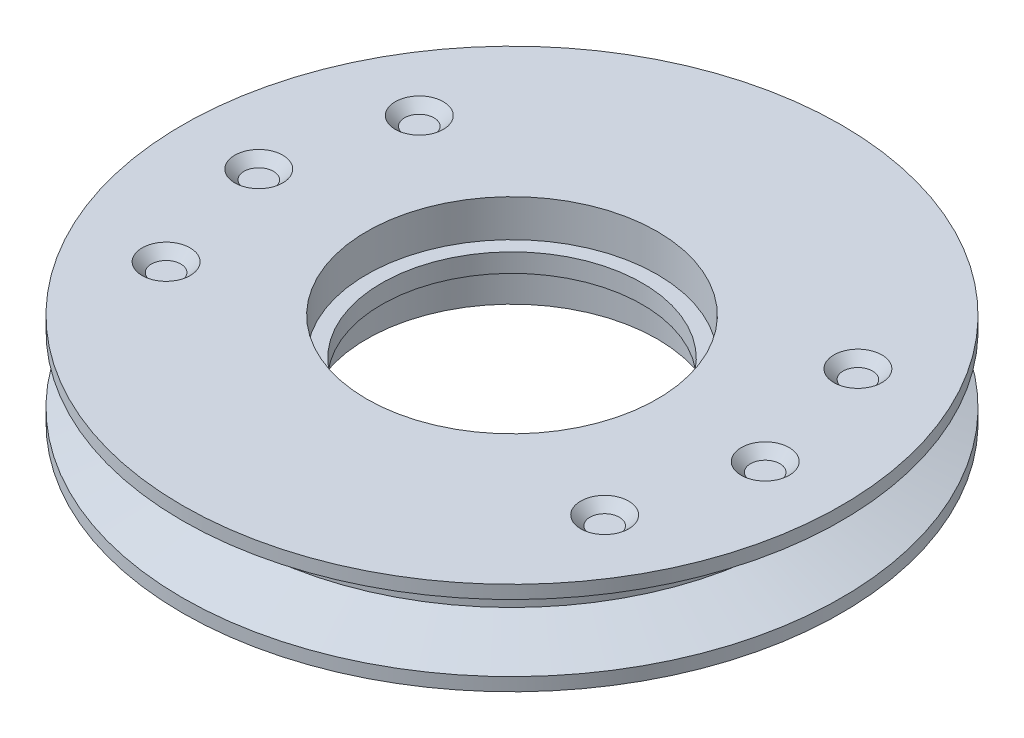
ISO-10303-21;
HEADER;
FILE_DESCRIPTION(('STEP AP214'),'2;1');
FILE_NAME('part.step','',(''),(''),'','','');
FILE_SCHEMA(('AUTOMOTIVE_DESIGN { 1 0 10303 214 1 1 1 1 }'));
ENDSEC;
DATA;
#1=APPLICATION_CONTEXT('core data for automotive mechanical design processes');
#2=APPLICATION_PROTOCOL_DEFINITION('international standard','automotive_design',2000,#1);
#3=PRODUCT_CONTEXT('',#1,'mechanical');
#4=PRODUCT('Part','Part','',(#3));
#5=PRODUCT_RELATED_PRODUCT_CATEGORY('part','',(#4));
#6=PRODUCT_DEFINITION_FORMATION('','',#4);
#7=PRODUCT_DEFINITION_CONTEXT('part definition',#1,'design');
#8=PRODUCT_DEFINITION('design','',#6,#7);
#9=PRODUCT_DEFINITION_SHAPE('','',#8);
#10=(LENGTH_UNIT() NAMED_UNIT(*) SI_UNIT(.MILLI.,.METRE.));
#11=(NAMED_UNIT(*) PLANE_ANGLE_UNIT() SI_UNIT($,.RADIAN.));
#12=(NAMED_UNIT(*) SI_UNIT($,.STERADIAN.) SOLID_ANGLE_UNIT());
#13=UNCERTAINTY_MEASURE_WITH_UNIT(LENGTH_MEASURE(1.E-05),#10,'distance_accuracy_value','');
#14=(GEOMETRIC_REPRESENTATION_CONTEXT(3) GLOBAL_UNCERTAINTY_ASSIGNED_CONTEXT((#13)) GLOBAL_UNIT_ASSIGNED_CONTEXT((#10,
#11,#12)) REPRESENTATION_CONTEXT('',''));
#15=CARTESIAN_POINT('',(0.,0.,0.));
#16=DIRECTION('',(0.,0.,1.));
#17=DIRECTION('',(1.,0.,0.));
#18=AXIS2_PLACEMENT_3D('',#15,#16,#17);
#19=CARTESIAN_POINT('',(0.,0.,0.));
#20=DIRECTION('',(0.,-1.,0.));
#21=DIRECTION('',(0.,0.,-1.));
#22=AXIS2_PLACEMENT_3D('',#19,#20,#21);
#23=CYLINDRICAL_SURFACE('',#22,39.);
#24=CARTESIAN_POINT('',(0.,-12.5,0.));
#25=DIRECTION('',(0.,-1.,0.));
#26=DIRECTION('',(0.,0.,-1.));
#27=AXIS2_PLACEMENT_3D('',#24,#25,#26);
#28=CIRCLE('',#27,39.);
#29=CARTESIAN_POINT('',(0.,-12.5,-39.));
#30=VERTEX_POINT('',#29);
#31=EDGE_CURVE('E77',#30,#30,#28,.T.);
#32=ORIENTED_EDGE('',*,*,#31,.T.);
#33=EDGE_LOOP('',(#32));
#34=FACE_BOUND('',#33,.T.);
#35=CARTESIAN_POINT('',(0.,-2.5,0.));
#36=DIRECTION('',(0.,1.,0.));
#37=DIRECTION('',(0.,0.,1.));
#38=AXIS2_PLACEMENT_3D('',#35,#36,#37);
#39=CIRCLE('',#38,39.);
#40=CARTESIAN_POINT('',(0.,-2.5,39.));
#41=VERTEX_POINT('',#40);
#42=EDGE_CURVE('E99',#41,#41,#39,.T.);
#43=ORIENTED_EDGE('',*,*,#42,.T.);
#44=EDGE_LOOP('',(#43));
#45=FACE_BOUND('',#44,.T.);
#46=ADVANCED_FACE('F37',(#34,#45),#23,.F.);
#47=CARTESIAN_POINT('',(0.,-12.5,-39.));
#48=DIRECTION('',(0.,-1.,0.));
#49=DIRECTION('',(0.,0.,-1.));
#50=AXIS2_PLACEMENT_3D('',#47,#48,#49);
#51=PLANE('',#50);
#52=CARTESIAN_POINT('',(0.,-12.5,0.));
#53=DIRECTION('',(0.,-1.,0.));
#54=DIRECTION('',(0.,0.,-1.));
#55=AXIS2_PLACEMENT_3D('',#52,#53,#54);
#56=CIRCLE('',#55,88.5);
#57=CARTESIAN_POINT('',(0.,-12.5,-88.5));
#58=VERTEX_POINT('',#57);
#59=EDGE_CURVE('E45',#58,#58,#56,.T.);
#60=ORIENTED_EDGE('',*,*,#59,.T.);
#61=EDGE_LOOP('',(#60));
#62=FACE_BOUND('',#61,.T.);
#63=ORIENTED_EDGE('',*,*,#31,.F.);
#64=EDGE_LOOP('',(#63));
#65=FACE_BOUND('',#64,.T.);
#66=ADVANCED_FACE('F39',(#62,#65),#51,.T.);
#67=CARTESIAN_POINT('',(0.,0.,0.));
#68=DIRECTION('',(0.,-1.,0.));
#69=DIRECTION('',(0.,0.,-1.));
#70=AXIS2_PLACEMENT_3D('',#67,#68,#69);
#71=CYLINDRICAL_SURFACE('',#70,88.5);
#72=CARTESIAN_POINT('',(0.,-8.95955351399292,0.));
#73=DIRECTION('',(0.,-1.,0.));
#74=DIRECTION('',(0.,0.,-1.));
#75=AXIS2_PLACEMENT_3D('',#72,#73,#74);
#76=CIRCLE('',#75,88.5);
#77=CARTESIAN_POINT('',(0.,-8.95955351399292,-88.5));
#78=VERTEX_POINT('',#77);
#79=EDGE_CURVE('E50',#78,#78,#76,.T.);
#80=ORIENTED_EDGE('',*,*,#79,.T.);
#81=EDGE_LOOP('',(#80));
#82=FACE_BOUND('',#81,.T.);
#83=ORIENTED_EDGE('',*,*,#59,.F.);
#84=EDGE_LOOP('',(#83));
#85=FACE_BOUND('',#84,.T.);
#86=ADVANCED_FACE('F167',(#82,#85),#71,.T.);
#87=CARTESIAN_POINT('',(0.,-8.95955351399292,0.));
#88=DIRECTION('',(0.,-1.,0.));
#89=DIRECTION('',(0.,0.,-1.));
#90=AXIS2_PLACEMENT_3D('',#87,#88,#89);
#91=CONICAL_SURFACE('',#90,88.5,1.22173047639604);
#92=CARTESIAN_POINT('',(0.,-3.5,0.));
#93=DIRECTION('',(0.,-1.,0.));
#94=DIRECTION('',(0.,0.,-1.));
#95=AXIS2_PLACEMENT_3D('',#92,#93,#94);
#96=CIRCLE('',#95,73.5);
#97=CARTESIAN_POINT('',(0.,-3.5,-73.5));
#98=VERTEX_POINT('',#97);
#99=EDGE_CURVE('E55',#98,#98,#96,.T.);
#100=ORIENTED_EDGE('',*,*,#99,.T.);
#101=EDGE_LOOP('',(#100));
#102=FACE_BOUND('',#101,.T.);
#103=ORIENTED_EDGE('',*,*,#79,.F.);
#104=EDGE_LOOP('',(#103));
#105=FACE_BOUND('',#104,.T.);
#106=ADVANCED_FACE('F203',(#102,#105),#91,.T.);
#107=CARTESIAN_POINT('',(0.,0.,0.));
#108=DIRECTION('',(0.,-1.,0.));
#109=DIRECTION('',(0.,0.,-1.));
#110=AXIS2_PLACEMENT_3D('',#107,#108,#109);
#111=CYLINDRICAL_SURFACE('',#110,73.5);
#112=CARTESIAN_POINT('',(0.,3.5,0.));
#113=DIRECTION('',(0.,-1.,0.));
#114=DIRECTION('',(0.,0.,-1.));
#115=AXIS2_PLACEMENT_3D('',#112,#113,#114);
#116=CIRCLE('',#115,73.5);
#117=CARTESIAN_POINT('',(0.,3.5,-73.5));
#118=VERTEX_POINT('',#117);
#119=EDGE_CURVE('E61',#118,#118,#116,.T.);
#120=ORIENTED_EDGE('',*,*,#119,.T.);
#121=EDGE_LOOP('',(#120));
#122=FACE_BOUND('',#121,.T.);
#123=ORIENTED_EDGE('',*,*,#99,.F.);
#124=EDGE_LOOP('',(#123));
#125=FACE_BOUND('',#124,.T.);
#126=ADVANCED_FACE('F197',(#122,#125),#111,.T.);
#127=CARTESIAN_POINT('',(0.,3.5,0.));
#128=DIRECTION('',(0.,1.,0.));
#129=DIRECTION('',(0.,0.,1.));
#130=AXIS2_PLACEMENT_3D('',#127,#128,#129);
#131=CONICAL_SURFACE('',#130,73.5,1.22173047639603);
#132=CARTESIAN_POINT('',(0.,8.95955351399305,0.));
#133=DIRECTION('',(0.,-1.,0.));
#134=DIRECTION('',(0.,0.,-1.));
#135=AXIS2_PLACEMENT_3D('',#132,#133,#134);
#136=CIRCLE('',#135,88.5);
#137=CARTESIAN_POINT('',(0.,8.95955351399305,-88.5));
#138=VERTEX_POINT('',#137);
#139=EDGE_CURVE('E65',#138,#138,#136,.T.);
#140=ORIENTED_EDGE('',*,*,#139,.T.);
#141=EDGE_LOOP('',(#140));
#142=FACE_BOUND('',#141,.T.);
#143=ORIENTED_EDGE('',*,*,#119,.F.);
#144=EDGE_LOOP('',(#143));
#145=FACE_BOUND('',#144,.T.);
#146=ADVANCED_FACE('F191',(#142,#145),#131,.T.);
#147=CARTESIAN_POINT('',(0.,0.,0.));
#148=DIRECTION('',(0.,-1.,0.));
#149=DIRECTION('',(0.,0.,-1.));
#150=AXIS2_PLACEMENT_3D('',#147,#148,#149);
#151=CYLINDRICAL_SURFACE('',#150,88.5);
#152=CARTESIAN_POINT('',(0.,12.5,0.));
#153=DIRECTION('',(0.,-1.,0.));
#154=DIRECTION('',(0.,0.,-1.));
#155=AXIS2_PLACEMENT_3D('',#152,#153,#154);
#156=CIRCLE('',#155,88.5);
#157=CARTESIAN_POINT('',(0.,12.5,-88.5));
#158=VERTEX_POINT('',#157);
#159=EDGE_CURVE('E69',#158,#158,#156,.T.);
#160=ORIENTED_EDGE('',*,*,#159,.T.);
#161=EDGE_LOOP('',(#160));
#162=FACE_BOUND('',#161,.T.);
#163=ORIENTED_EDGE('',*,*,#139,.F.);
#164=EDGE_LOOP('',(#163));
#165=FACE_BOUND('',#164,.T.);
#166=ADVANCED_FACE('F181',(#162,#165),#151,.T.);
#167=CARTESIAN_POINT('',(0.,12.5,-39.));
#168=DIRECTION('',(0.,1.,0.));
#169=DIRECTION('',(0.,0.,1.));
#170=AXIS2_PLACEMENT_3D('',#167,#168,#169);
#171=PLANE('',#170);
#172=CARTESIAN_POINT('',(-58.8897274573418,12.5,-34.0000000000001));
#173=DIRECTION('',(0.,1.,0.));
#174=DIRECTION('',(0.,0.,-1.));
#175=AXIS2_PLACEMENT_3D('',#172,#173,#174);
#176=CIRCLE('',#175,6.45);
#177=CARTESIAN_POINT('',(-58.8897274573418,12.5,-40.4500000000001));
#178=VERTEX_POINT('',#177);
#179=EDGE_CURVE('E95',#178,#178,#176,.T.);
#180=ORIENTED_EDGE('',*,*,#179,.F.);
#181=EDGE_LOOP('',(#180));
#182=FACE_BOUND('',#181,.T.);
#183=CARTESIAN_POINT('',(68.,12.5,0.));
#184=DIRECTION('',(0.,1.,0.));
#185=DIRECTION('',(0.,0.,1.));
#186=AXIS2_PLACEMENT_3D('',#183,#184,#185);
#187=CIRCLE('',#186,6.45);
#188=CARTESIAN_POINT('',(68.,12.5,6.45));
#189=VERTEX_POINT('',#188);
#190=EDGE_CURVE('E94',#189,#189,#187,.T.);
#191=ORIENTED_EDGE('',*,*,#190,.F.);
#192=EDGE_LOOP('',(#191));
#193=FACE_BOUND('',#192,.T.);
#194=CARTESIAN_POINT('',(-68.,12.5,0.));
#195=DIRECTION('',(0.,1.,0.));
#196=DIRECTION('',(0.,0.,-1.));
#197=AXIS2_PLACEMENT_3D('',#194,#195,#196);
#198=CIRCLE('',#197,6.45);
#199=CARTESIAN_POINT('',(-68.,12.5,-6.45));
#200=VERTEX_POINT('',#199);
#201=EDGE_CURVE('E104',#200,#200,#198,.T.);
#202=ORIENTED_EDGE('',*,*,#201,.F.);
#203=EDGE_LOOP('',(#202));
#204=FACE_BOUND('',#203,.T.);
#205=CARTESIAN_POINT('',(-58.8897274573418,12.5,34.0000000000001));
#206=DIRECTION('',(0.,1.,0.));
#207=DIRECTION('',(0.,0.,1.));
#208=AXIS2_PLACEMENT_3D('',#205,#206,#207);
#209=CIRCLE('',#208,6.45);
#210=CARTESIAN_POINT('',(-58.8897274573418,12.5,40.4500000000001));
#211=VERTEX_POINT('',#210);
#212=EDGE_CURVE('E112',#211,#211,#209,.T.);
#213=ORIENTED_EDGE('',*,*,#212,.F.);
#214=EDGE_LOOP('',(#213));
#215=FACE_BOUND('',#214,.T.);
#216=CARTESIAN_POINT('',(58.8897274573418,12.5,34.0000000000001));
#217=DIRECTION('',(0.,1.,0.));
#218=DIRECTION('',(0.,0.,-1.));
#219=AXIS2_PLACEMENT_3D('',#216,#217,#218);
#220=CIRCLE('',#219,6.45);
#221=CARTESIAN_POINT('',(58.8897274573418,12.5,27.5500000000001));
#222=VERTEX_POINT('',#221);
#223=EDGE_CURVE('E120',#222,#222,#220,.T.);
#224=ORIENTED_EDGE('',*,*,#223,.F.);
#225=EDGE_LOOP('',(#224));
#226=FACE_BOUND('',#225,.T.);
#227=CARTESIAN_POINT('',(58.8897274573418,12.5,-34.0000000000001));
#228=DIRECTION('',(0.,1.,0.));
#229=DIRECTION('',(0.,0.,1.));
#230=AXIS2_PLACEMENT_3D('',#227,#228,#229);
#231=CIRCLE('',#230,6.45);
#232=CARTESIAN_POINT('',(58.8897274573418,12.5,-27.5500000000001));
#233=VERTEX_POINT('',#232);
#234=EDGE_CURVE('E85',#233,#233,#231,.T.);
#235=ORIENTED_EDGE('',*,*,#234,.F.);
#236=EDGE_LOOP('',(#235));
#237=FACE_BOUND('',#236,.T.);
#238=CARTESIAN_POINT('',(0.,12.5,0.));
#239=DIRECTION('',(0.,-1.,0.));
#240=DIRECTION('',(0.,0.,-1.));
#241=AXIS2_PLACEMENT_3D('',#238,#239,#240);
#242=CIRCLE('',#241,39.);
#243=CARTESIAN_POINT('',(0.,12.5,-39.));
#244=VERTEX_POINT('',#243);
#245=EDGE_CURVE('E73',#244,#244,#242,.T.);
#246=ORIENTED_EDGE('',*,*,#245,.T.);
#247=EDGE_LOOP('',(#246));
#248=FACE_BOUND('',#247,.T.);
#249=ORIENTED_EDGE('',*,*,#159,.F.);
#250=EDGE_LOOP('',(#249));
#251=FACE_BOUND('',#250,.T.);
#252=ADVANCED_FACE('F173',(#182,#193,#204,#215,#226,#237,#248,#251),#171,.T.);
#253=CARTESIAN_POINT('',(0.,2.5,0.));
#254=DIRECTION('',(0.,1.,0.));
#255=DIRECTION('',(0.,0.,1.));
#256=AXIS2_PLACEMENT_3D('',#253,#254,#255);
#257=CIRCLE('',#256,39.);
#258=CARTESIAN_POINT('',(0.,2.5,39.));
#259=VERTEX_POINT('',#258);
#260=EDGE_CURVE('E10',#259,#259,#257,.T.);
#261=ORIENTED_EDGE('',*,*,#260,.F.);
#262=EDGE_LOOP('',(#261));
#263=FACE_BOUND('',#262,.T.);
#264=ORIENTED_EDGE('',*,*,#245,.F.);
#265=EDGE_LOOP('',(#264));
#266=FACE_BOUND('',#265,.T.);
#267=ADVANCED_FACE('F163',(#263,#266),#23,.F.);
#268=CARTESIAN_POINT('',(58.8897274573418,12.5,-34.0000000000001));
#269=DIRECTION('',(0.,1.,0.));
#270=DIRECTION('',(0.,0.,1.));
#271=AXIS2_PLACEMENT_3D('',#268,#269,#270);
#272=CONICAL_SURFACE('',#271,6.45,0.78539816339745);
#273=CARTESIAN_POINT('',(58.8897274573418,10.,-34.0000000000001));
#274=DIRECTION('',(0.,1.,0.));
#275=DIRECTION('',(0.,0.,1.));
#276=AXIS2_PLACEMENT_3D('',#273,#274,#275);
#277=CIRCLE('',#276,3.94999999999999);
#278=CARTESIAN_POINT('',(58.8897274573418,10.,-30.0500000000001));
#279=VERTEX_POINT('',#278);
#280=EDGE_CURVE('E81',#279,#279,#277,.T.);
#281=ORIENTED_EDGE('',*,*,#280,.F.);
#282=EDGE_LOOP('',(#281));
#283=FACE_BOUND('',#282,.T.);
#284=ORIENTED_EDGE('',*,*,#234,.T.);
#285=EDGE_LOOP('',(#284));
#286=FACE_BOUND('',#285,.T.);
#287=ADVANCED_FACE('F172',(#283,#286),#272,.F.);
#288=CARTESIAN_POINT('',(58.8897274573418,10.,-34.0000000000001));
#289=DIRECTION('',(0.,1.,0.));
#290=DIRECTION('',(0.,0.,1.));
#291=AXIS2_PLACEMENT_3D('',#288,#289,#290);
#292=PLANE('',#291);
#293=ORIENTED_EDGE('',*,*,#280,.T.);
#294=EDGE_LOOP('',(#293));
#295=FACE_BOUND('',#294,.T.);
#296=ADVANCED_FACE('F179',(#295),#292,.T.);
#297=CARTESIAN_POINT('',(58.8897274573418,12.5,34.0000000000001));
#298=DIRECTION('',(0.,1.,0.));
#299=DIRECTION('',(0.,0.,-1.));
#300=AXIS2_PLACEMENT_3D('',#297,#298,#299);
#301=CONICAL_SURFACE('',#300,6.45,0.78539816339745);
#302=CARTESIAN_POINT('',(58.8897274573418,10.,34.0000000000001));
#303=DIRECTION('',(0.,-1.,0.));
#304=DIRECTION('',(0.,0.,-1.));
#305=AXIS2_PLACEMENT_3D('',#302,#303,#304);
#306=CIRCLE('',#305,3.94999999999999);
#307=CARTESIAN_POINT('',(58.8897274573418,10.,30.0500000000001));
#308=VERTEX_POINT('',#307);
#309=EDGE_CURVE('E89',#308,#308,#306,.F.);
#310=ORIENTED_EDGE('',*,*,#309,.F.);
#311=EDGE_LOOP('',(#310));
#312=FACE_BOUND('',#311,.T.);
#313=ORIENTED_EDGE('',*,*,#223,.T.);
#314=EDGE_LOOP('',(#313));
#315=FACE_BOUND('',#314,.T.);
#316=ADVANCED_FACE('F254',(#312,#315),#301,.F.);
#317=CARTESIAN_POINT('',(58.8897274573418,10.,34.0000000000001));
#318=DIRECTION('',(0.,-1.,0.));
#319=DIRECTION('',(0.,0.,-1.));
#320=AXIS2_PLACEMENT_3D('',#317,#318,#319);
#321=PLANE('',#320);
#322=ORIENTED_EDGE('',*,*,#309,.T.);
#323=EDGE_LOOP('',(#322));
#324=FACE_BOUND('',#323,.T.);
#325=ADVANCED_FACE('F264',(#324),#321,.F.);
#326=CARTESIAN_POINT('',(-58.8897274573418,12.5,34.0000000000001));
#327=DIRECTION('',(0.,1.,0.));
#328=DIRECTION('',(0.,0.,1.));
#329=AXIS2_PLACEMENT_3D('',#326,#327,#328);
#330=CONICAL_SURFACE('',#329,6.45,0.78539816339745);
#331=CARTESIAN_POINT('',(-58.8897274573418,10.,34.0000000000001));
#332=DIRECTION('',(0.,1.,0.));
#333=DIRECTION('',(0.,0.,1.));
#334=AXIS2_PLACEMENT_3D('',#331,#332,#333);
#335=CIRCLE('',#334,3.94999999999999);
#336=CARTESIAN_POINT('',(-58.8897274573418,10.,37.9500000000001));
#337=VERTEX_POINT('',#336);
#338=EDGE_CURVE('E116',#337,#337,#335,.T.);
#339=ORIENTED_EDGE('',*,*,#338,.F.);
#340=EDGE_LOOP('',(#339));
#341=FACE_BOUND('',#340,.T.);
#342=ORIENTED_EDGE('',*,*,#212,.T.);
#343=EDGE_LOOP('',(#342));
#344=FACE_BOUND('',#343,.T.);
#345=ADVANCED_FACE('F274',(#341,#344),#330,.F.);
#346=CARTESIAN_POINT('',(-58.8897274573418,10.,34.0000000000001));
#347=DIRECTION('',(0.,1.,0.));
#348=DIRECTION('',(0.,0.,1.));
#349=AXIS2_PLACEMENT_3D('',#346,#347,#348);
#350=PLANE('',#349);
#351=ORIENTED_EDGE('',*,*,#338,.T.);
#352=EDGE_LOOP('',(#351));
#353=FACE_BOUND('',#352,.T.);
#354=ADVANCED_FACE('F284',(#353),#350,.T.);
#355=CARTESIAN_POINT('',(-68.,12.5,0.));
#356=DIRECTION('',(0.,1.,0.));
#357=DIRECTION('',(0.,0.,-1.));
#358=AXIS2_PLACEMENT_3D('',#355,#356,#357);
#359=CONICAL_SURFACE('',#358,6.45,0.78539816339745);
#360=CARTESIAN_POINT('',(-68.,10.,0.));
#361=DIRECTION('',(0.,-1.,0.));
#362=DIRECTION('',(0.,0.,-1.));
#363=AXIS2_PLACEMENT_3D('',#360,#361,#362);
#364=CIRCLE('',#363,3.94999999999999);
#365=CARTESIAN_POINT('',(-68.,10.,-3.94999999999999));
#366=VERTEX_POINT('',#365);
#367=EDGE_CURVE('E108',#366,#366,#364,.F.);
#368=ORIENTED_EDGE('',*,*,#367,.F.);
#369=EDGE_LOOP('',(#368));
#370=FACE_BOUND('',#369,.T.);
#371=ORIENTED_EDGE('',*,*,#201,.T.);
#372=EDGE_LOOP('',(#371));
#373=FACE_BOUND('',#372,.T.);
#374=ADVANCED_FACE('F294',(#370,#373),#359,.F.);
#375=CARTESIAN_POINT('',(-68.,10.,0.));
#376=DIRECTION('',(0.,-1.,0.));
#377=DIRECTION('',(0.,0.,-1.));
#378=AXIS2_PLACEMENT_3D('',#375,#376,#377);
#379=PLANE('',#378);
#380=ORIENTED_EDGE('',*,*,#367,.T.);
#381=EDGE_LOOP('',(#380));
#382=FACE_BOUND('',#381,.T.);
#383=ADVANCED_FACE('F304',(#382),#379,.F.);
#384=CARTESIAN_POINT('',(68.,12.5,0.));
#385=DIRECTION('',(0.,1.,0.));
#386=DIRECTION('',(0.,0.,1.));
#387=AXIS2_PLACEMENT_3D('',#384,#385,#386);
#388=CONICAL_SURFACE('',#387,6.45,0.78539816339745);
#389=CARTESIAN_POINT('',(68.,10.,0.));
#390=DIRECTION('',(0.,1.,0.));
#391=DIRECTION('',(0.,0.,1.));
#392=AXIS2_PLACEMENT_3D('',#389,#390,#391);
#393=CIRCLE('',#392,3.94999999999999);
#394=CARTESIAN_POINT('',(68.,10.,3.94999999999999));
#395=VERTEX_POINT('',#394);
#396=EDGE_CURVE('E100',#395,#395,#393,.T.);
#397=ORIENTED_EDGE('',*,*,#396,.F.);
#398=EDGE_LOOP('',(#397));
#399=FACE_BOUND('',#398,.T.);
#400=ORIENTED_EDGE('',*,*,#190,.T.);
#401=EDGE_LOOP('',(#400));
#402=FACE_BOUND('',#401,.T.);
#403=ADVANCED_FACE('F314',(#399,#402),#388,.F.);
#404=CARTESIAN_POINT('',(68.,10.,0.));
#405=DIRECTION('',(0.,1.,0.));
#406=DIRECTION('',(0.,0.,1.));
#407=AXIS2_PLACEMENT_3D('',#404,#405,#406);
#408=PLANE('',#407);
#409=ORIENTED_EDGE('',*,*,#396,.T.);
#410=EDGE_LOOP('',(#409));
#411=FACE_BOUND('',#410,.T.);
#412=ADVANCED_FACE('F324',(#411),#408,.T.);
#413=CARTESIAN_POINT('',(-58.8897274573418,12.5,-34.0000000000001));
#414=DIRECTION('',(0.,1.,0.));
#415=DIRECTION('',(0.,0.,-1.));
#416=AXIS2_PLACEMENT_3D('',#413,#414,#415);
#417=CONICAL_SURFACE('',#416,6.45,0.78539816339745);
#418=CARTESIAN_POINT('',(-58.8897274573418,10.,-34.0000000000001));
#419=DIRECTION('',(0.,-1.,0.));
#420=DIRECTION('',(0.,0.,-1.));
#421=AXIS2_PLACEMENT_3D('',#418,#419,#420);
#422=CIRCLE('',#421,3.94999999999999);
#423=CARTESIAN_POINT('',(-58.8897274573418,10.,-37.9500000000001));
#424=VERTEX_POINT('',#423);
#425=EDGE_CURVE('E90',#424,#424,#422,.F.);
#426=ORIENTED_EDGE('',*,*,#425,.F.);
#427=EDGE_LOOP('',(#426));
#428=FACE_BOUND('',#427,.T.);
#429=ORIENTED_EDGE('',*,*,#179,.T.);
#430=EDGE_LOOP('',(#429));
#431=FACE_BOUND('',#430,.T.);
#432=ADVANCED_FACE('F156',(#428,#431),#417,.F.);
#433=CARTESIAN_POINT('',(-58.8897274573418,10.,-34.0000000000001));
#434=DIRECTION('',(0.,-1.,0.));
#435=DIRECTION('',(0.,0.,-1.));
#436=AXIS2_PLACEMENT_3D('',#433,#434,#435);
#437=PLANE('',#436);
#438=ORIENTED_EDGE('',*,*,#425,.T.);
#439=EDGE_LOOP('',(#438));
#440=FACE_BOUND('',#439,.T.);
#441=ADVANCED_FACE('F148',(#440),#437,.F.);
#442=CARTESIAN_POINT('',(0.,2.5,0.));
#443=DIRECTION('',(0.,1.,0.));
#444=DIRECTION('',(0.,0.,1.));
#445=AXIS2_PLACEMENT_3D('',#442,#443,#444);
#446=PLANE('',#445);
#447=ORIENTED_EDGE('',*,*,#260,.T.);
#448=EDGE_LOOP('',(#447));
#449=FACE_BOUND('',#448,.T.);
#450=CARTESIAN_POINT('',(0.,2.5,0.));
#451=DIRECTION('',(0.,1.,0.));
#452=DIRECTION('',(0.,0.,1.));
#453=AXIS2_PLACEMENT_3D('',#450,#451,#452);
#454=CIRCLE('',#453,35.);
#455=CARTESIAN_POINT('',(0.,2.5,35.));
#456=VERTEX_POINT('',#455);
#457=EDGE_CURVE('E133',#456,#456,#454,.T.);
#458=ORIENTED_EDGE('',*,*,#457,.F.);
#459=EDGE_LOOP('',(#458));
#460=FACE_BOUND('',#459,.T.);
#461=ADVANCED_FACE('F145',(#449,#460),#446,.T.);
#462=CARTESIAN_POINT('',(0.,-2.5,0.));
#463=DIRECTION('',(0.,1.,0.));
#464=DIRECTION('',(0.,0.,1.));
#465=AXIS2_PLACEMENT_3D('',#462,#463,#464);
#466=PLANE('',#465);
#467=ORIENTED_EDGE('',*,*,#42,.F.);
#468=EDGE_LOOP('',(#467));
#469=FACE_BOUND('',#468,.T.);
#470=CARTESIAN_POINT('',(0.,-2.5,0.));
#471=DIRECTION('',(0.,1.,0.));
#472=DIRECTION('',(0.,0.,1.));
#473=AXIS2_PLACEMENT_3D('',#470,#471,#472);
#474=CIRCLE('',#473,35.);
#475=CARTESIAN_POINT('',(0.,-2.5,35.));
#476=VERTEX_POINT('',#475);
#477=EDGE_CURVE('E134',#476,#476,#474,.T.);
#478=ORIENTED_EDGE('',*,*,#477,.T.);
#479=EDGE_LOOP('',(#478));
#480=FACE_BOUND('',#479,.T.);
#481=ADVANCED_FACE('F147',(#469,#480),#466,.F.);
#482=CARTESIAN_POINT('',(0.,2.5,0.));
#483=DIRECTION('',(0.,-1.,0.));
#484=DIRECTION('',(0.,0.,-1.));
#485=AXIS2_PLACEMENT_3D('',#482,#483,#484);
#486=CYLINDRICAL_SURFACE('',#485,35.);
#487=ORIENTED_EDGE('',*,*,#457,.T.);
#488=EDGE_LOOP('',(#487));
#489=FACE_BOUND('',#488,.T.);
#490=ORIENTED_EDGE('',*,*,#477,.F.);
#491=EDGE_LOOP('',(#490));
#492=FACE_BOUND('',#491,.T.);
#493=ADVANCED_FACE('F142',(#489,#492),#486,.F.);
#494=CLOSED_SHELL('',(#46,#66,#86,#106,#126,#146,#166,#252,#267,#287,#296,#316,#325,#345,#354,
#374,#383,#403,#412,#432,#441,#461,#481,#493));
#495=MANIFOLD_SOLID_BREP('B2',#494);
#496=ADVANCED_BREP_SHAPE_REPRESENTATION('',(#18,#495),#14);
#497=SHAPE_DEFINITION_REPRESENTATION(#9,#496);
ENDSEC;
END-ISO-10303-21;
